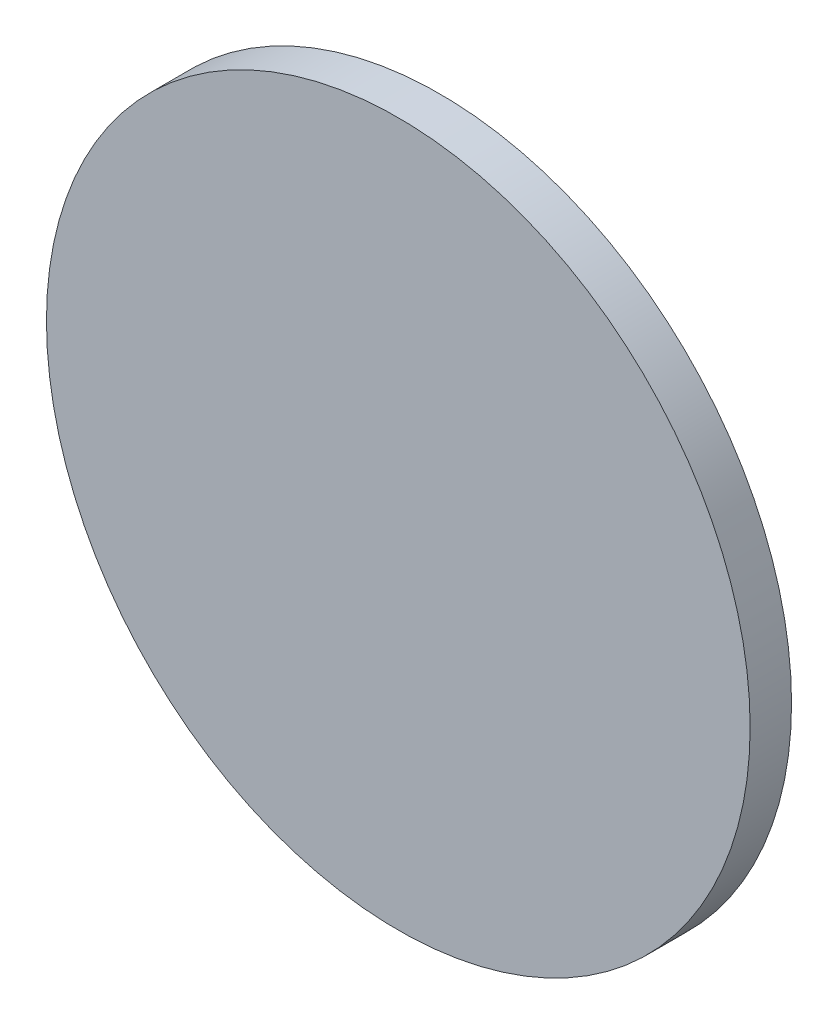
ISO-10303-21;
HEADER;
FILE_DESCRIPTION(('STEP AP214'),'2;1');
FILE_NAME('part.step','',(''),(''),'','','');
FILE_SCHEMA(('AUTOMOTIVE_DESIGN { 1 0 10303 214 1 1 1 1 }'));
ENDSEC;
DATA;
#1=APPLICATION_CONTEXT('core data for automotive mechanical design processes');
#2=APPLICATION_PROTOCOL_DEFINITION('international standard','automotive_design',2000,#1);
#3=PRODUCT_CONTEXT('',#1,'mechanical');
#4=PRODUCT('Part','Part','',(#3));
#5=PRODUCT_RELATED_PRODUCT_CATEGORY('part','',(#4));
#6=PRODUCT_DEFINITION_FORMATION('','',#4);
#7=PRODUCT_DEFINITION_CONTEXT('part definition',#1,'design');
#8=PRODUCT_DEFINITION('design','',#6,#7);
#9=PRODUCT_DEFINITION_SHAPE('','',#8);
#10=(LENGTH_UNIT() NAMED_UNIT(*) SI_UNIT(.MILLI.,.METRE.));
#11=(NAMED_UNIT(*) PLANE_ANGLE_UNIT() SI_UNIT($,.RADIAN.));
#12=(NAMED_UNIT(*) SI_UNIT($,.STERADIAN.) SOLID_ANGLE_UNIT());
#13=UNCERTAINTY_MEASURE_WITH_UNIT(LENGTH_MEASURE(1.E-05),#10,'distance_accuracy_value','');
#14=(GEOMETRIC_REPRESENTATION_CONTEXT(3) GLOBAL_UNCERTAINTY_ASSIGNED_CONTEXT((#13)) GLOBAL_UNIT_ASSIGNED_CONTEXT((#10,
#11,#12)) REPRESENTATION_CONTEXT('',''));
#15=CARTESIAN_POINT('',(0.,0.,0.));
#16=DIRECTION('',(0.,0.,1.));
#17=DIRECTION('',(1.,0.,0.));
#18=AXIS2_PLACEMENT_3D('',#15,#16,#17);
#19=CARTESIAN_POINT('',(24.65,20.,0.));
#20=DIRECTION('',(0.,0.,1.));
#21=DIRECTION('',(1.,0.,0.));
#22=AXIS2_PLACEMENT_3D('',#19,#20,#21);
#23=PLANE('',#22);
#24=CARTESIAN_POINT('',(24.65,20.,0.));
#25=DIRECTION('',(0.,0.,1.));
#26=DIRECTION('',(1.,0.,0.));
#27=AXIS2_PLACEMENT_3D('',#24,#25,#26);
#28=CIRCLE('',#27,4.25);
#29=CARTESIAN_POINT('',(20.4,20.,0.));
#30=VERTEX_POINT('',#29);
#31=EDGE_CURVE('E39',#30,#30,#28,.T.);
#32=ORIENTED_EDGE('',*,*,#31,.F.);
#33=EDGE_LOOP('',(#32));
#34=FACE_BOUND('',#33,.T.);
#35=ADVANCED_FACE('F32',(#34),#23,.F.);
#36=CARTESIAN_POINT('',(24.65,20.,12.5208152801713));
#37=DIRECTION('',(0.,0.,-1.));
#38=DIRECTION('',(-1.,0.,0.));
#39=AXIS2_PLACEMENT_3D('',#36,#37,#38);
#40=CYLINDRICAL_SURFACE('',#39,4.25);
#41=CARTESIAN_POINT('',(24.65,20.,0.5));
#42=DIRECTION('',(0.,0.,-1.));
#43=DIRECTION('',(-1.,0.,0.));
#44=AXIS2_PLACEMENT_3D('',#41,#42,#43);
#45=CIRCLE('',#44,4.25);
#46=CARTESIAN_POINT('',(20.4,20.,0.500000000000002));
#47=VERTEX_POINT('',#46);
#48=EDGE_CURVE('E10',#47,#47,#45,.T.);
#49=CARTESIAN_POINT('',(20.4,20.,0.500000000000002));
#50=CARTESIAN_POINT('',(20.4,20.,0.494791666666669));
#51=CARTESIAN_POINT('',(20.4,20.,0.489583333333335));
#52=CARTESIAN_POINT('',(20.4,20.,0.479166666666669));
#53=CARTESIAN_POINT('',(20.4,20.,0.473958333333335));
#54=CARTESIAN_POINT('',(20.4,20.,0.463541666666669));
#55=CARTESIAN_POINT('',(20.4,20.,0.458333333333335));
#56=CARTESIAN_POINT('',(20.4,20.,0.447916666666669));
#57=CARTESIAN_POINT('',(20.4,20.,0.442708333333335));
#58=CARTESIAN_POINT('',(20.4,20.,0.432291666666669));
#59=CARTESIAN_POINT('',(20.4,20.,0.427083333333335));
#60=CARTESIAN_POINT('',(20.4,20.,0.416666666666669));
#61=CARTESIAN_POINT('',(20.4,20.,0.411458333333335));
#62=CARTESIAN_POINT('',(20.4,20.,0.401041666666669));
#63=CARTESIAN_POINT('',(20.4,20.,0.395833333333335));
#64=CARTESIAN_POINT('',(20.4,20.,0.385416666666669));
#65=CARTESIAN_POINT('',(20.4,20.,0.380208333333335));
#66=CARTESIAN_POINT('',(20.4,20.,0.369791666666668));
#67=CARTESIAN_POINT('',(20.4,20.,0.364583333333334));
#68=CARTESIAN_POINT('',(20.4,20.,0.354166666666667));
#69=CARTESIAN_POINT('',(20.4,20.,0.348958333333334));
#70=CARTESIAN_POINT('',(20.4,20.,0.338541666666667));
#71=CARTESIAN_POINT('',(20.4,20.,0.333333333333334));
#72=CARTESIAN_POINT('',(20.4,20.,0.322916666666667));
#73=CARTESIAN_POINT('',(20.4,20.,0.317708333333334));
#74=CARTESIAN_POINT('',(20.4,20.,0.307291666666667));
#75=CARTESIAN_POINT('',(20.4,20.,0.302083333333334));
#76=CARTESIAN_POINT('',(20.4,20.,0.291666666666667));
#77=CARTESIAN_POINT('',(20.4,20.,0.286458333333334));
#78=CARTESIAN_POINT('',(20.4,20.,0.276041666666667));
#79=CARTESIAN_POINT('',(20.4,20.,0.270833333333334));
#80=CARTESIAN_POINT('',(20.4,20.,0.260416666666667));
#81=CARTESIAN_POINT('',(20.4,20.,0.255208333333334));
#82=CARTESIAN_POINT('',(20.4,20.,0.244791666666667));
#83=CARTESIAN_POINT('',(20.4,20.,0.239583333333334));
#84=CARTESIAN_POINT('',(20.4,20.,0.229166666666667));
#85=CARTESIAN_POINT('',(20.4,20.,0.223958333333334));
#86=CARTESIAN_POINT('',(20.4,20.,0.213541666666667));
#87=CARTESIAN_POINT('',(20.4,20.,0.208333333333334));
#88=CARTESIAN_POINT('',(20.4,20.,0.197916666666667));
#89=CARTESIAN_POINT('',(20.4,20.,0.192708333333334));
#90=CARTESIAN_POINT('',(20.4,20.,0.182291666666667));
#91=CARTESIAN_POINT('',(20.4,20.,0.177083333333333));
#92=CARTESIAN_POINT('',(20.4,20.,0.166666666666667));
#93=CARTESIAN_POINT('',(20.4,20.,0.161458333333333));
#94=CARTESIAN_POINT('',(20.4,20.,0.151041666666667));
#95=CARTESIAN_POINT('',(20.4,20.,0.145833333333333));
#96=CARTESIAN_POINT('',(20.4,20.,0.135416666666666));
#97=CARTESIAN_POINT('',(20.4,20.,0.130208333333332));
#98=CARTESIAN_POINT('',(20.4,20.,0.119791666666665));
#99=CARTESIAN_POINT('',(20.4,20.,0.114583333333332));
#100=CARTESIAN_POINT('',(20.4,20.,0.104166666666665));
#101=CARTESIAN_POINT('',(20.4,20.,0.0989583333333317));
#102=CARTESIAN_POINT('',(20.4,20.,0.088541666666665));
#103=CARTESIAN_POINT('',(20.4,20.,0.0833333333333317));
#104=CARTESIAN_POINT('',(20.4,20.,0.072916666666665));
#105=CARTESIAN_POINT('',(20.4,20.,0.0677083333333317));
#106=CARTESIAN_POINT('',(20.4,20.,0.057291666666665));
#107=CARTESIAN_POINT('',(20.4,20.,0.0520833333333316));
#108=CARTESIAN_POINT('',(20.4,20.,0.041666666666665));
#109=CARTESIAN_POINT('',(20.4,20.,0.0364583333333316));
#110=CARTESIAN_POINT('',(20.4,20.,0.026041666666665));
#111=CARTESIAN_POINT('',(20.4,20.,0.0208333333333316));
#112=CARTESIAN_POINT('',(20.4,20.,0.0104166666666649));
#113=CARTESIAN_POINT('',(20.4,20.,0.0052083333333316));
#114=CARTESIAN_POINT('',(20.4,20.,0.));
#115=B_SPLINE_CURVE_WITH_KNOTS('',3,(#49,#50,#51,#52,#53,#54,#55,#56,#57,#58,#59,#60,#61,#62,
#63,#64,#65,#66,#67,#68,#69,#70,#71,#72,#73,#74,#75,#76,#77,#78,#79,#80,#81,#82,#83,#84,#85,#86,
#87,#88,#89,#90,#91,#92,#93,#94,#95,#96,#97,#98,#99,#100,#101,#102,#103,#104,#105,#106,#107,
#108,#109,#110,#111,#112,#113,#114),.UNSPECIFIED.,.F.,.F.,(4,2,2,2,2,2,2,2,2,2,2,2,2,2,2,2,2,2,
2,2,2,2,2,2,2,2,2,2,2,2,2,2,4),(0.,0.015625,0.03125,0.046875,0.0625000000000001,
0.0781250000000001,0.0937500000000001,0.109375,0.125,0.140625000000002,0.156250000000002,
0.171875000000002,0.187500000000002,0.203125000000002,0.218750000000002,0.234375000000002,
0.250000000000002,0.265625000000002,0.281250000000002,0.296875000000002,0.312500000000002,
0.328125000000002,0.343750000000002,0.359375000000002,0.375000000000004,0.390625000000004,
0.406250000000004,0.421875000000004,0.437500000000004,0.453125000000004,0.468750000000004,
0.484375000000004,0.500000000000004),.UNSPECIFIED.);
#116=EDGE_CURVE('BSEAM34',#47,#30,#115,.T.);
#117=ORIENTED_EDGE('',*,*,#48,.T.);
#118=ORIENTED_EDGE('',*,*,#31,.T.);
#119=ORIENTED_EDGE('',*,*,#116,.T.);
#120=ORIENTED_EDGE('',*,*,#116,.F.);
#121=EDGE_LOOP('',(#117,#119,#118,#120));
#122=FACE_BOUND('',#121,.T.);
#123=ADVANCED_FACE('F34',(#122),#40,.T.);
#124=CARTESIAN_POINT('',(0.,0.,0.5));
#125=DIRECTION('',(0.,0.,-1.));
#126=DIRECTION('',(-1.,0.,0.));
#127=AXIS2_PLACEMENT_3D('',#124,#125,#126);
#128=PLANE('',#127);
#129=ORIENTED_EDGE('',*,*,#48,.F.);
#130=EDGE_LOOP('',(#129));
#131=FACE_BOUND('',#130,.T.);
#132=ADVANCED_FACE('F50',(#131),#128,.F.);
#133=CLOSED_SHELL('',(#35,#123,#132));
#134=MANIFOLD_SOLID_BREP('B2',#133);
#135=ADVANCED_BREP_SHAPE_REPRESENTATION('',(#18,#134),#14);
#136=SHAPE_DEFINITION_REPRESENTATION(#9,#135);
ENDSEC;
END-ISO-10303-21;
